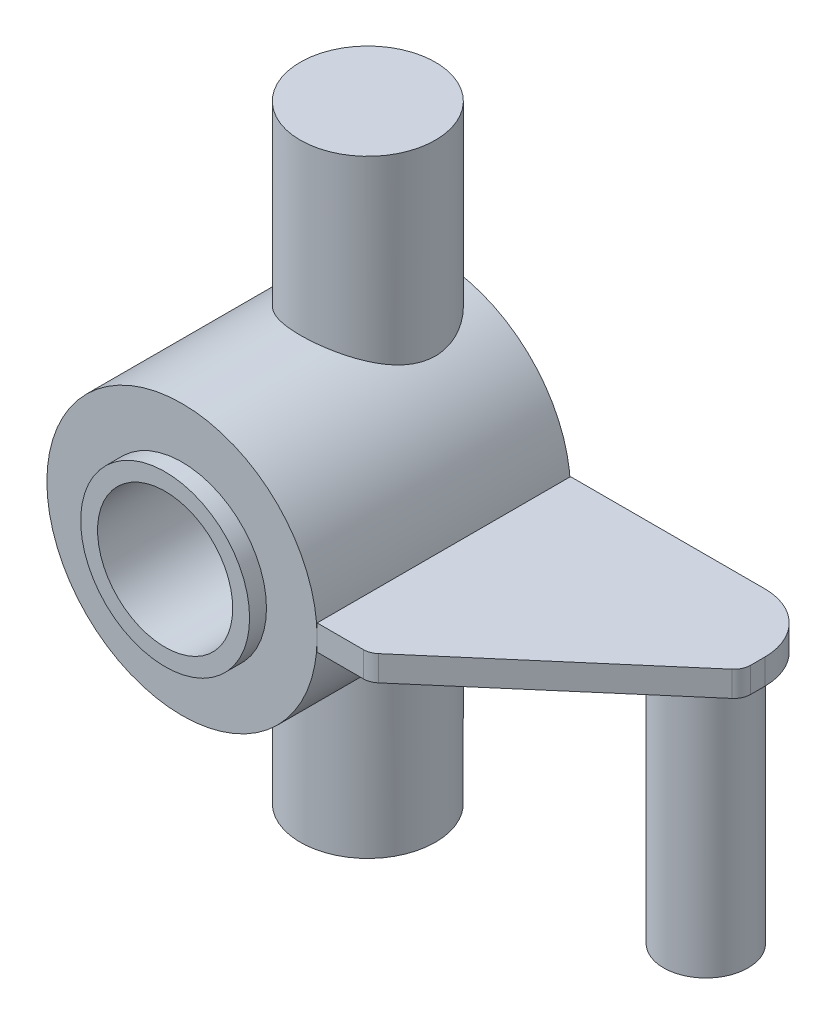
ISO-10303-21;
HEADER;
FILE_DESCRIPTION(('STEP AP214'),'2;1');
FILE_NAME('part.step','',(''),(''),'','','');
FILE_SCHEMA(('AUTOMOTIVE_DESIGN { 1 0 10303 214 1 1 1 1 }'));
ENDSEC;
DATA;
#1=APPLICATION_CONTEXT('core data for automotive mechanical design processes');
#2=APPLICATION_PROTOCOL_DEFINITION('international standard','automotive_design',2000,#1);
#3=PRODUCT_CONTEXT('',#1,'mechanical');
#4=PRODUCT('Part','Part','',(#3));
#5=PRODUCT_RELATED_PRODUCT_CATEGORY('part','',(#4));
#6=PRODUCT_DEFINITION_FORMATION('','',#4);
#7=PRODUCT_DEFINITION_CONTEXT('part definition',#1,'design');
#8=PRODUCT_DEFINITION('design','',#6,#7);
#9=PRODUCT_DEFINITION_SHAPE('','',#8);
#10=(LENGTH_UNIT() NAMED_UNIT(*) SI_UNIT(.MILLI.,.METRE.));
#11=(NAMED_UNIT(*) PLANE_ANGLE_UNIT() SI_UNIT($,.RADIAN.));
#12=(NAMED_UNIT(*) SI_UNIT($,.STERADIAN.) SOLID_ANGLE_UNIT());
#13=UNCERTAINTY_MEASURE_WITH_UNIT(LENGTH_MEASURE(1.E-05),#10,'distance_accuracy_value','');
#14=(GEOMETRIC_REPRESENTATION_CONTEXT(3) GLOBAL_UNCERTAINTY_ASSIGNED_CONTEXT((#13)) GLOBAL_UNIT_ASSIGNED_CONTEXT((#10,
#11,#12)) REPRESENTATION_CONTEXT('',''));
#15=CARTESIAN_POINT('',(0.,0.,0.));
#16=DIRECTION('',(0.,0.,1.));
#17=DIRECTION('',(1.,0.,0.));
#18=AXIS2_PLACEMENT_3D('',#15,#16,#17);
#19=CARTESIAN_POINT('',(23.,0.750000000000004,0.));
#20=DIRECTION('',(0.,-1.,0.));
#21=DIRECTION('',(0.,0.,-1.));
#22=AXIS2_PLACEMENT_3D('',#19,#20,#21);
#23=PLANE('',#22);
#24=DIRECTION('',(0.758813097039513,0.,-0.651308439805062));
#25=VECTOR('',#24,1.);
#26=CARTESIAN_POINT('',(25.3687248158512,0.750000000000003,2.75970539256084));
#27=LINE('',#26,#25);
#28=CARTESIAN_POINT('',(11.3890501755666,0.749999999999998,14.7588130970395));
#29=VERTEX_POINT('',#28);
#30=CARTESIAN_POINT('',(22.6513084398051,0.750000000000002,5.09213247781869));
#31=VERTEX_POINT('',#30);
#32=EDGE_CURVE('E123',#29,#31,#27,.T.);
#33=ORIENTED_EDGE('',*,*,#32,.T.);
#34=CARTESIAN_POINT('',(22.,0.750000000000002,4.33331938077917));
#35=DIRECTION('',(0.,-1.,0.));
#36=DIRECTION('',(0.,0.,-1.));
#37=AXIS2_PLACEMENT_3D('',#34,#35,#36);
#38=CIRCLE('',#37,1.);
#39=CARTESIAN_POINT('',(23.,0.750000000000002,4.33331938077917));
#40=VERTEX_POINT('',#39);
#41=EDGE_CURVE('E71',#31,#40,#38,.F.);
#42=ORIENTED_EDGE('',*,*,#41,.T.);
#43=DIRECTION('',(0.,0.,1.));
#44=VECTOR('',#43,1.);
#45=CARTESIAN_POINT('',(23.,0.750000000000004,0.));
#46=LINE('',#45,#44);
#47=CARTESIAN_POINT('',(23.,0.750000000000002,3.5));
#48=VERTEX_POINT('',#47);
#49=EDGE_CURVE('E143',#48,#40,#46,.T.);
#50=ORIENTED_EDGE('',*,*,#49,.F.);
#51=CARTESIAN_POINT('',(19.5,0.750000000000002,3.5));
#52=DIRECTION('',(0.,-1.,0.));
#53=DIRECTION('',(0.,0.,-1.));
#54=AXIS2_PLACEMENT_3D('',#51,#52,#53);
#55=CIRCLE('',#54,3.5);
#56=CARTESIAN_POINT('',(19.5,0.750000000000004,0.));
#57=VERTEX_POINT('',#56);
#58=EDGE_CURVE('E132',#57,#48,#55,.T.);
#59=ORIENTED_EDGE('',*,*,#58,.F.);
#60=DIRECTION('',(-1.,0.,0.));
#61=VECTOR('',#60,1.);
#62=CARTESIAN_POINT('',(23.,0.750000000000004,0.));
#63=LINE('',#62,#61);
#64=CARTESIAN_POINT('',(8.,0.750000000000004,0.));
#65=VERTEX_POINT('',#64);
#66=EDGE_CURVE('E131',#57,#65,#63,.T.);
#67=ORIENTED_EDGE('',*,*,#66,.T.);
#68=DIRECTION('',(0.,0.,1.));
#69=VECTOR('',#68,1.);
#70=CARTESIAN_POINT('',(8.,0.750000000000004,0.));
#71=LINE('',#70,#69);
#72=CARTESIAN_POINT('',(8.,0.749999999999998,15.));
#73=VERTEX_POINT('',#72);
#74=EDGE_CURVE('E223',#65,#73,#71,.T.);
#75=ORIENTED_EDGE('',*,*,#74,.T.);
#76=DIRECTION('',(-1.,0.,0.));
#77=VECTOR('',#76,1.);
#78=CARTESIAN_POINT('',(23.,0.749999999999998,15.));
#79=LINE('',#78,#77);
#80=CARTESIAN_POINT('',(10.7377417357616,0.749999999999998,15.));
#81=VERTEX_POINT('',#80);
#82=EDGE_CURVE('E141',#81,#73,#79,.T.);
#83=ORIENTED_EDGE('',*,*,#82,.F.);
#84=CARTESIAN_POINT('',(10.7377417357616,0.749999999999999,14.));
#85=DIRECTION('',(0.,-1.,0.));
#86=DIRECTION('',(0.,0.,-1.));
#87=AXIS2_PLACEMENT_3D('',#84,#85,#86);
#88=CIRCLE('',#87,1.);
#89=EDGE_CURVE('E158',#81,#29,#88,.F.);
#90=ORIENTED_EDGE('',*,*,#89,.T.);
#91=EDGE_LOOP('',(#33,#42,#50,#59,#67,#75,#83,#90));
#92=FACE_BOUND('',#91,.T.);
#93=ADVANCED_FACE('F48',(#92),#23,.F.);
#94=CARTESIAN_POINT('',(23.,-0.750000000000004,0.));
#95=DIRECTION('',(0.,1.,0.));
#96=DIRECTION('',(0.,0.,1.));
#97=AXIS2_PLACEMENT_3D('',#94,#95,#96);
#98=PLANE('',#97);
#99=CARTESIAN_POINT('',(19.4463189334762,-0.750000000000004,3.43499495567666));
#100=DIRECTION('',(0.,1.,0.));
#101=DIRECTION('',(0.,0.,1.));
#102=AXIS2_PLACEMENT_3D('',#99,#100,#101);
#103=CIRCLE('',#102,2.5);
#104=CARTESIAN_POINT('',(19.4463189334762,-0.750000000000004,5.93499495567665));
#105=VERTEX_POINT('',#104);
#106=EDGE_CURVE('E12',#105,#105,#103,.F.);
#107=ORIENTED_EDGE('',*,*,#106,.F.);
#108=EDGE_LOOP('',(#107));
#109=FACE_BOUND('',#108,.T.);
#110=DIRECTION('',(0.,0.,-1.));
#111=VECTOR('',#110,1.);
#112=CARTESIAN_POINT('',(23.,-0.750000000000004,0.));
#113=LINE('',#112,#111);
#114=CARTESIAN_POINT('',(23.,-0.750000000000003,4.33331938077917));
#115=VERTEX_POINT('',#114);
#116=CARTESIAN_POINT('',(23.,-0.750000000000003,3.5));
#117=VERTEX_POINT('',#116);
#118=EDGE_CURVE('E139',#115,#117,#113,.T.);
#119=ORIENTED_EDGE('',*,*,#118,.F.);
#120=CARTESIAN_POINT('',(22.,-0.750000000000004,4.33331938077917));
#121=DIRECTION('',(0.,1.,0.));
#122=DIRECTION('',(0.,0.,1.));
#123=AXIS2_PLACEMENT_3D('',#120,#121,#122);
#124=CIRCLE('',#123,1.);
#125=CARTESIAN_POINT('',(22.6513084398051,-0.750000000000003,5.09213247781868));
#126=VERTEX_POINT('',#125);
#127=EDGE_CURVE('E56',#115,#126,#124,.F.);
#128=ORIENTED_EDGE('',*,*,#127,.T.);
#129=DIRECTION('',(0.758813097039512,0.,-0.651308439805062));
#130=VECTOR('',#129,1.);
#131=CARTESIAN_POINT('',(12.1253865423612,-0.750000000000002,14.1267970022992));
#132=LINE('',#131,#130);
#133=CARTESIAN_POINT('',(11.3890501755666,-0.750000000000002,14.7588130970395));
#134=VERTEX_POINT('',#133);
#135=EDGE_CURVE('E167',#134,#126,#132,.T.);
#136=ORIENTED_EDGE('',*,*,#135,.F.);
#137=CARTESIAN_POINT('',(10.7377417357616,-0.750000000000002,14.));
#138=DIRECTION('',(0.,1.,0.));
#139=DIRECTION('',(0.,0.,1.));
#140=AXIS2_PLACEMENT_3D('',#137,#138,#139);
#141=CIRCLE('',#140,1.);
#142=CARTESIAN_POINT('',(10.7377417357616,-0.750000000000002,15.));
#143=VERTEX_POINT('',#142);
#144=EDGE_CURVE('E154',#134,#143,#141,.F.);
#145=ORIENTED_EDGE('',*,*,#144,.T.);
#146=DIRECTION('',(-1.,0.,0.));
#147=VECTOR('',#146,1.);
#148=CARTESIAN_POINT('',(23.,-0.750000000000002,15.));
#149=LINE('',#148,#147);
#150=CARTESIAN_POINT('',(8.,-0.750000000000002,15.));
#151=VERTEX_POINT('',#150);
#152=EDGE_CURVE('E138',#143,#151,#149,.T.);
#153=ORIENTED_EDGE('',*,*,#152,.T.);
#154=DIRECTION('',(0.,0.,-1.));
#155=VECTOR('',#154,1.);
#156=CARTESIAN_POINT('',(8.,-0.750000000000004,0.));
#157=LINE('',#156,#155);
#158=CARTESIAN_POINT('',(8.,-0.750000000000004,0.));
#159=VERTEX_POINT('',#158);
#160=EDGE_CURVE('E136',#151,#159,#157,.T.);
#161=ORIENTED_EDGE('',*,*,#160,.T.);
#162=DIRECTION('',(-1.,0.,0.));
#163=VECTOR('',#162,1.);
#164=CARTESIAN_POINT('',(23.,-0.750000000000004,0.));
#165=LINE('',#164,#163);
#166=CARTESIAN_POINT('',(19.5,-0.750000000000004,0.));
#167=VERTEX_POINT('',#166);
#168=EDGE_CURVE('E129',#167,#159,#165,.T.);
#169=ORIENTED_EDGE('',*,*,#168,.F.);
#170=CARTESIAN_POINT('',(19.5,-0.750000000000003,3.5));
#171=DIRECTION('',(0.,-1.,0.));
#172=DIRECTION('',(0.,0.,-1.));
#173=AXIS2_PLACEMENT_3D('',#170,#171,#172);
#174=CIRCLE('',#173,3.5);
#175=EDGE_CURVE('E114',#167,#117,#174,.T.);
#176=ORIENTED_EDGE('',*,*,#175,.T.);
#177=EDGE_LOOP('',(#119,#128,#136,#145,#153,#161,#169,#176));
#178=FACE_BOUND('',#177,.T.);
#179=ADVANCED_FACE('F134',(#109,#178),#98,.F.);
#180=CARTESIAN_POINT('',(23.,-0.750000000000004,0.));
#181=DIRECTION('',(0.,0.,1.));
#182=DIRECTION('',(0.,-1.,0.));
#183=AXIS2_PLACEMENT_3D('',#180,#181,#182);
#184=PLANE('',#183);
#185=ORIENTED_EDGE('',*,*,#66,.F.);
#186=DIRECTION('',(0.,-1.,0.));
#187=VECTOR('',#186,1.);
#188=CARTESIAN_POINT('',(19.5,14.25,0.));
#189=LINE('',#188,#187);
#190=EDGE_CURVE('E117',#57,#167,#189,.T.);
#191=ORIENTED_EDGE('',*,*,#190,.T.);
#192=ORIENTED_EDGE('',*,*,#168,.T.);
#193=DIRECTION('',(0.,1.,0.));
#194=VECTOR('',#193,1.);
#195=CARTESIAN_POINT('',(8.,-0.750000000000004,0.));
#196=LINE('',#195,#194);
#197=EDGE_CURVE('E220',#159,#65,#196,.T.);
#198=ORIENTED_EDGE('',*,*,#197,.T.);
#199=EDGE_LOOP('',(#185,#191,#192,#198));
#200=FACE_BOUND('',#199,.T.);
#201=ADVANCED_FACE('F127',(#200),#184,.F.);
#202=CARTESIAN_POINT('',(23.,-0.750000000000002,15.));
#203=DIRECTION('',(0.,0.,-1.));
#204=DIRECTION('',(-1.,0.,0.));
#205=AXIS2_PLACEMENT_3D('',#202,#203,#204);
#206=PLANE('',#205);
#207=ORIENTED_EDGE('',*,*,#152,.F.);
#208=DIRECTION('',(0.,-1.,0.));
#209=VECTOR('',#208,1.);
#210=CARTESIAN_POINT('',(10.7377417357616,-0.750000000000004,15.));
#211=LINE('',#210,#209);
#212=EDGE_CURVE('E156',#143,#81,#211,.F.);
#213=ORIENTED_EDGE('',*,*,#212,.T.);
#214=ORIENTED_EDGE('',*,*,#82,.T.);
#215=DIRECTION('',(0.,-1.,0.));
#216=VECTOR('',#215,1.);
#217=CARTESIAN_POINT('',(8.,-0.750000000000002,15.));
#218=LINE('',#217,#216);
#219=EDGE_CURVE('E213',#73,#151,#218,.T.);
#220=ORIENTED_EDGE('',*,*,#219,.T.);
#221=EDGE_LOOP('',(#207,#213,#214,#220));
#222=FACE_BOUND('',#221,.T.);
#223=ADVANCED_FACE('F196',(#222),#206,.F.);
#224=CARTESIAN_POINT('',(23.,0.,0.));
#225=DIRECTION('',(1.,0.,0.));
#226=DIRECTION('',(0.,0.,-1.));
#227=AXIS2_PLACEMENT_3D('',#224,#225,#226);
#228=PLANE('',#227);
#229=ORIENTED_EDGE('',*,*,#49,.T.);
#230=DIRECTION('',(0.,1.,0.));
#231=VECTOR('',#230,1.);
#232=CARTESIAN_POINT('',(23.,-0.750000000000002,4.33331938077917));
#233=LINE('',#232,#231);
#234=EDGE_CURVE('E63',#40,#115,#233,.F.);
#235=ORIENTED_EDGE('',*,*,#234,.T.);
#236=ORIENTED_EDGE('',*,*,#118,.T.);
#237=DIRECTION('',(0.,-1.,0.));
#238=VECTOR('',#237,1.);
#239=CARTESIAN_POINT('',(23.,14.25,3.5));
#240=LINE('',#239,#238);
#241=EDGE_CURVE('E120',#48,#117,#240,.T.);
#242=ORIENTED_EDGE('',*,*,#241,.F.);
#243=EDGE_LOOP('',(#229,#235,#236,#242));
#244=FACE_BOUND('',#243,.T.);
#245=ADVANCED_FACE('F201',(#244),#228,.T.);
#246=CARTESIAN_POINT('',(8.,0.,0.));
#247=DIRECTION('',(1.,0.,0.));
#248=DIRECTION('',(0.,0.,-1.));
#249=AXIS2_PLACEMENT_3D('',#246,#247,#248);
#250=PLANE('',#249);
#251=ORIENTED_EDGE('',*,*,#197,.F.);
#252=ORIENTED_EDGE('',*,*,#160,.F.);
#253=ORIENTED_EDGE('',*,*,#219,.F.);
#254=ORIENTED_EDGE('',*,*,#74,.F.);
#255=EDGE_LOOP('',(#251,#252,#253,#254));
#256=FACE_BOUND('',#255,.T.);
#257=ADVANCED_FACE('F206',(#256),#250,.F.);
#258=CARTESIAN_POINT('',(19.5,14.25,3.5));
#259=DIRECTION('',(0.,-1.,0.));
#260=DIRECTION('',(0.,0.,-1.));
#261=AXIS2_PLACEMENT_3D('',#258,#259,#260);
#262=CYLINDRICAL_SURFACE('',#261,3.5);
#263=ORIENTED_EDGE('',*,*,#58,.T.);
#264=ORIENTED_EDGE('',*,*,#241,.T.);
#265=ORIENTED_EDGE('',*,*,#175,.F.);
#266=ORIENTED_EDGE('',*,*,#190,.F.);
#267=EDGE_LOOP('',(#263,#264,#265,#266));
#268=FACE_BOUND('',#267,.T.);
#269=ADVANCED_FACE('F116',(#268),#262,.T.);
#270=CARTESIAN_POINT('',(12.1253865423612,14.25,14.1267970022992));
#271=DIRECTION('',(-0.651308439805061,0.,-0.758813097039512));
#272=DIRECTION('',(-0.758813097039513,0.,0.651308439805062));
#273=AXIS2_PLACEMENT_3D('',#270,#271,#272);
#274=PLANE('',#273);
#275=ORIENTED_EDGE('',*,*,#135,.T.);
#276=DIRECTION('',(0.,1.,0.));
#277=VECTOR('',#276,1.);
#278=CARTESIAN_POINT('',(22.6513084398051,0.750000000000003,5.09213247781868));
#279=LINE('',#278,#277);
#280=EDGE_CURVE('E160',#126,#31,#279,.T.);
#281=ORIENTED_EDGE('',*,*,#280,.T.);
#282=ORIENTED_EDGE('',*,*,#32,.F.);
#283=DIRECTION('',(0.,-1.,0.));
#284=VECTOR('',#283,1.);
#285=CARTESIAN_POINT('',(11.3890501755666,14.25,14.7588130970395));
#286=LINE('',#285,#284);
#287=EDGE_CURVE('E151',#29,#134,#286,.T.);
#288=ORIENTED_EDGE('',*,*,#287,.T.);
#289=EDGE_LOOP('',(#275,#281,#282,#288));
#290=FACE_BOUND('',#289,.T.);
#291=ADVANCED_FACE('F171',(#290),#274,.F.);
#292=CARTESIAN_POINT('',(10.7377417357616,14.25,14.));
#293=DIRECTION('',(0.,-1.,0.));
#294=DIRECTION('',(1.,0.,0.));
#295=AXIS2_PLACEMENT_3D('',#292,#293,#294);
#296=CYLINDRICAL_SURFACE('',#295,1.);
#297=ORIENTED_EDGE('',*,*,#89,.F.);
#298=ORIENTED_EDGE('',*,*,#212,.F.);
#299=ORIENTED_EDGE('',*,*,#144,.F.);
#300=ORIENTED_EDGE('',*,*,#287,.F.);
#301=EDGE_LOOP('',(#297,#298,#299,#300));
#302=FACE_BOUND('',#301,.T.);
#303=ADVANCED_FACE('F178',(#302),#296,.T.);
#304=CARTESIAN_POINT('',(22.,14.25,4.33331938077917));
#305=DIRECTION('',(0.,-1.,0.));
#306=DIRECTION('',(0.,0.,-1.));
#307=AXIS2_PLACEMENT_3D('',#304,#305,#306);
#308=CYLINDRICAL_SURFACE('',#307,1.);
#309=ORIENTED_EDGE('',*,*,#127,.F.);
#310=ORIENTED_EDGE('',*,*,#234,.F.);
#311=ORIENTED_EDGE('',*,*,#41,.F.);
#312=ORIENTED_EDGE('',*,*,#280,.F.);
#313=EDGE_LOOP('',(#309,#310,#311,#312));
#314=FACE_BOUND('',#313,.T.);
#315=ADVANCED_FACE('F50',(#314),#308,.T.);
#316=CARTESIAN_POINT('',(19.4463189334762,-15.75,3.43499495567666));
#317=DIRECTION('',(0.,1.,0.));
#318=DIRECTION('',(0.,0.,1.));
#319=AXIS2_PLACEMENT_3D('',#316,#317,#318);
#320=CYLINDRICAL_SURFACE('',#319,2.5);
#321=CARTESIAN_POINT('',(19.4463189334762,-15.75,3.43499495567666));
#322=DIRECTION('',(0.,-1.,0.));
#323=DIRECTION('',(0.,0.,-1.));
#324=AXIS2_PLACEMENT_3D('',#321,#322,#323);
#325=CIRCLE('',#324,2.5);
#326=CARTESIAN_POINT('',(19.4463189334762,-15.75,0.93499495567666));
#327=VERTEX_POINT('',#326);
#328=EDGE_CURVE('E174',#327,#327,#325,.T.);
#329=ORIENTED_EDGE('',*,*,#328,.F.);
#330=EDGE_LOOP('',(#329));
#331=FACE_BOUND('',#330,.T.);
#332=ORIENTED_EDGE('',*,*,#106,.T.);
#333=EDGE_LOOP('',(#332));
#334=FACE_BOUND('',#333,.T.);
#335=ADVANCED_FACE('F177',(#331,#334),#320,.T.);
#336=CARTESIAN_POINT('',(0.,-15.75,0.));
#337=DIRECTION('',(0.,-1.,0.));
#338=DIRECTION('',(0.,0.,-1.));
#339=AXIS2_PLACEMENT_3D('',#336,#337,#338);
#340=PLANE('',#339);
#341=ORIENTED_EDGE('',*,*,#328,.T.);
#342=EDGE_LOOP('',(#341));
#343=FACE_BOUND('',#342,.T.);
#344=ADVANCED_FACE('F183',(#343),#340,.T.);
#345=CLOSED_SHELL('',(#93,#179,#201,#223,#245,#257,#269,#291,#303,#315,#335,#344));
#346=MANIFOLD_SOLID_BREP('B2',#345);
#347=CARTESIAN_POINT('',(0.,18.,4.));
#348=DIRECTION('',(0.,-1.,0.));
#349=DIRECTION('',(0.,0.,-1.));
#350=AXIS2_PLACEMENT_3D('',#347,#348,#349);
#351=CYLINDRICAL_SURFACE('',#350,4.);
#352=CARTESIAN_POINT('',(0.,18.,4.));
#353=DIRECTION('',(0.,1.,0.));
#354=DIRECTION('',(0.,0.,1.));
#355=AXIS2_PLACEMENT_3D('',#352,#353,#354);
#356=CIRCLE('',#355,4.);
#357=CARTESIAN_POINT('',(0.,18.,8.));
#358=VERTEX_POINT('',#357);
#359=EDGE_CURVE('E47',#358,#358,#356,.T.);
#360=ORIENTED_EDGE('',*,*,#359,.F.);
#361=EDGE_LOOP('',(#360));
#362=FACE_BOUND('',#361,.T.);
#363=CARTESIAN_POINT('',(0.,8.,8.));
#364=CARTESIAN_POINT('',(0.105191216468488,7.99999964432188,7.99999959515221));
#365=CARTESIAN_POINT('',(0.210389995368427,7.99792027620652,7.99584554268467));
#366=CARTESIAN_POINT('',(0.420011249701336,7.98965597150982,7.97927792190077));
#367=CARTESIAN_POINT('',(0.524433367425618,7.98346924887743,7.96686076043045));
#368=CARTESIAN_POINT('',(0.731828138370605,7.96713597659603,7.93388648530473));
#369=CARTESIAN_POINT('',(0.834798506711917,7.95698378017499,7.9133177633431));
#370=CARTESIAN_POINT('',(1.0384152051955,7.93298382243633,7.86428279244356));
#371=CARTESIAN_POINT('',(1.1390605669938,7.91913455043164,7.83581331493588));
#372=CARTESIAN_POINT('',(1.43561775388138,7.87265974292142,7.73925176888222));
#373=CARTESIAN_POINT('',(1.6271962065847,7.83501976471674,7.65983701915264));
#374=CARTESIAN_POINT('',(1.99392146995421,7.74982886318845,7.47371095891235));
#375=CARTESIAN_POINT('',(2.16906957469774,7.70227872135526,7.36700180061893));
#376=CARTESIAN_POINT('',(2.51002321260362,7.59825056785886,7.12193017740055));
#377=CARTESIAN_POINT('',(2.67462250306452,7.54140647262265,6.98204331180567));
#378=CARTESIAN_POINT('',(2.97911611963431,7.42640030348014,6.67792486241435));
#379=CARTESIAN_POINT('',(3.11899161990724,7.3682372629647,6.51367490095672));
#380=CARTESIAN_POINT('',(3.38102385527715,7.25195135134797,6.15002101287013));
#381=CARTESIAN_POINT('',(3.50096528772936,7.19418138823907,5.94887869572524));
#382=CARTESIAN_POINT('',(3.65378721735264,7.11709930290977,5.63206546004573));
#383=CARTESIAN_POINT('',(3.70022392693971,7.09299422837207,5.5239053371934));
#384=CARTESIAN_POINT('',(3.78359067078057,7.04887690211806,5.30319902892111));
#385=CARTESIAN_POINT('',(3.82052633371565,7.02886222858683,5.19065548607789));
#386=CARTESIAN_POINT('',(3.88251046204454,6.9948044998643,4.96880578069376));
#387=CARTESIAN_POINT('',(3.9081340887804,6.9804776446802,4.85970358083543));
#388=CARTESIAN_POINT('',(3.95018060072941,6.95677065788593,4.63925947717983));
#389=CARTESIAN_POINT('',(3.96660836750271,6.9473879018896,4.52791879424739));
#390=CARTESIAN_POINT('',(3.99001913809428,6.93396933490057,4.30399390653389));
#391=CARTESIAN_POINT('',(3.99700782997252,6.92993030376772,4.19141049191159));
#392=CARTESIAN_POINT('',(4.00144340059851,6.92737022415464,3.96599952196127));
#393=CARTESIAN_POINT('',(3.99889118971828,6.92884864921082,3.853171990953));
#394=CARTESIAN_POINT('',(3.98516575152016,6.93675038555112,3.64183562155368));
#395=CARTESIAN_POINT('',(3.97506329407581,6.94255931040713,3.54323256042783));
#396=CARTESIAN_POINT('',(3.94763759493625,6.95818925294571,3.34734838783369));
#397=CARTESIAN_POINT('',(3.93031208534669,6.96801153072177,3.2500677014795));
#398=CARTESIAN_POINT('',(3.86777248849784,7.00304835203764,2.96122086709978));
#399=CARTESIAN_POINT('',(3.81198555026409,7.03383903740602,2.77250454291879));
#400=CARTESIAN_POINT('',(3.67283599572519,7.10749917506982,2.4030536672292));
#401=CARTESIAN_POINT('',(3.58886132884632,7.15063327143764,2.22260742465183));
#402=CARTESIAN_POINT('',(3.39616568981264,7.2441365265382,1.87746981298511));
#403=CARTESIAN_POINT('',(3.28743360222607,7.29450893132236,1.71278556793507));
#404=CARTESIAN_POINT('',(3.03227252755196,7.40452458073482,1.38191711829539));
#405=CARTESIAN_POINT('',(2.88281182497071,7.46453347888883,1.21819042929159));
#406=CARTESIAN_POINT('',(2.55818830727484,7.58191186589975,0.917040393499512));
#407=CARTESIAN_POINT('',(2.38301327894514,7.63928008344308,0.779629617525468));
#408=CARTESIAN_POINT('',(2.09944472683198,7.7202760768617,0.593246969785754));
#409=CARTESIAN_POINT('',(1.9989679987013,7.74696304862188,0.533318240246936));
#410=CARTESIAN_POINT('',(1.79256850112001,7.79730441532266,0.42223352122335));
#411=CARTESIAN_POINT('',(1.68664805204876,7.82096008757468,0.37107383360208));
#412=CARTESIAN_POINT('',(1.47010242051538,7.86454042959534,0.278080877627199));
#413=CARTESIAN_POINT('',(1.35947915341347,7.88446660078232,0.236243854867457));
#414=CARTESIAN_POINT('',(1.13432950721217,7.91999221203723,0.162380061448199));
#415=CARTESIAN_POINT('',(1.01980357880328,7.9355921498224,0.130352162240849));
#416=CARTESIAN_POINT('',(0.797438403015335,7.96087677585623,0.0787731521448827));
#417=CARTESIAN_POINT('',(0.68983090685457,7.9709443603734,0.058408402943018));
#418=CARTESIAN_POINT('',(0.472998720376382,7.98674429615844,0.0265535517575012));
#419=CARTESIAN_POINT('',(0.363774173887724,7.99247703065614,0.0150626652629393));
#420=CARTESIAN_POINT('',(0.144648447401173,7.99944300548302,0.00110952845549016));
#421=CARTESIAN_POINT('',(0.0347475425961453,8.00067796839692,-0.00135617837901456));
#422=CARTESIAN_POINT('',(-0.184837638972486,7.99861804620746,0.00276424211008771));
#423=CARTESIAN_POINT('',(-0.294521925108021,7.99532336157662,0.00934996883659231));
#424=CARTESIAN_POINT('',(-0.504259611746538,7.98472734940324,0.0306235695271645));
#425=CARTESIAN_POINT('',(-0.604398259266984,7.97775776257091,0.0446410691044307));
#426=CARTESIAN_POINT('',(-0.803035609307668,7.96021983565123,0.0801363996639103));
#427=CARTESIAN_POINT('',(-0.901533743070587,7.94965027363514,0.101616763793442));
#428=CARTESIAN_POINT('',(-1.19351737727532,7.91289127905722,0.176935173599938));
#429=CARTESIAN_POINT('',(-1.38368108667204,7.88164133135127,0.241670140590663));
#430=CARTESIAN_POINT('',(-1.75558493783058,7.80736894774679,0.399998108905637));
#431=CARTESIAN_POINT('',(-1.93692876519228,7.76403545540105,0.494363309171963));
#432=CARTESIAN_POINT('',(-2.28183826656572,7.66975878800211,0.708431034259749));
#433=CARTESIAN_POINT('',(-2.44539632212196,7.61881237399843,0.828144352631561));
#434=CARTESIAN_POINT('',(-2.76706877708067,7.50833088367007,1.10303311970347));
#435=CARTESIAN_POINT('',(-2.92307134240145,7.44844369061623,1.26053653725913));
#436=CARTESIAN_POINT('',(-3.20744226426287,7.33048735856255,1.5997355652547));
#437=CARTESIAN_POINT('',(-3.33579150415337,7.27241950081065,1.7814477716031));
#438=CARTESIAN_POINT('',(-3.50772930633183,7.19028164087441,2.0739940144221));
#439=CARTESIAN_POINT('',(-3.5626157867948,7.16316684054651,2.17748375843627));
#440=CARTESIAN_POINT('',(-3.66334616154282,7.11217812644117,2.38951843531651));
#441=CARTESIAN_POINT('',(-3.70919441458265,7.08830265221425,2.49806090009515));
#442=CARTESIAN_POINT('',(-3.79131200961919,7.04472262103751,2.71942164536428));
#443=CARTESIAN_POINT('',(-3.82758904080802,7.02501471854545,2.83223640979536));
#444=CARTESIAN_POINT('',(-3.89012004539429,6.9905825381999,3.06135278907153));
#445=CARTESIAN_POINT('',(-3.91637557070638,6.97585748874971,3.17765386102154));
#446=CARTESIAN_POINT('',(-3.95643062416587,6.95321025619991,3.40141213316309));
#447=CARTESIAN_POINT('',(-3.97118378192521,6.94477079792059,3.50864683290839));
#448=CARTESIAN_POINT('',(-3.99195118317071,6.93285441469714,3.72422767020064));
#449=CARTESIAN_POINT('',(-3.99796634225491,6.92937696981658,3.8325736901013));
#450=CARTESIAN_POINT('',(-4.00116308319383,6.92753208063799,4.04940749673038));
#451=CARTESIAN_POINT('',(-3.99834777004019,6.9291628401807,4.15789522022328));
#452=CARTESIAN_POINT('',(-3.98394653809981,6.9374509348198,4.37406114711354));
#453=CARTESIAN_POINT('',(-3.97236097836303,6.94410806413885,4.48173938346867));
#454=CARTESIAN_POINT('',(-3.92770249100378,6.96952879582861,4.7818001370413));
#455=CARTESIAN_POINT('',(-3.88483285002042,6.99372760142387,4.97236586731381));
#456=CARTESIAN_POINT('',(-3.77270184038046,7.05483682415845,5.34326850255324));
#457=CARTESIAN_POINT('',(-3.70343198216887,7.09175132993569,5.52360209570391));
#458=CARTESIAN_POINT('',(-3.53526338936952,7.17714225279385,5.882488553514));
#459=CARTESIAN_POINT('',(-3.43468670285354,7.22622883383996,6.06010777576172));
#460=CARTESIAN_POINT('',(-3.20860173383709,7.3294133274236,6.39710197827703));
#461=CARTESIAN_POINT('',(-3.08308048046464,7.38351383930109,6.55646739854074));
#462=CARTESIAN_POINT('',(-2.79282250805389,7.49849148240842,6.8725629090385));
#463=CARTESIAN_POINT('',(-2.62517402605099,7.55939328373464,7.02661992962373));
#464=CARTESIAN_POINT('',(-2.26458287075638,7.67511613929542,7.3050684228129));
#465=CARTESIAN_POINT('',(-2.07162664990559,7.72993390744395,7.42944390524207));
#466=CARTESIAN_POINT('',(-1.76603106757846,7.80335210517359,7.59090424941519));
#467=CARTESIAN_POINT('',(-1.66100410373827,7.82643367929072,7.64069364140905));
#468=CARTESIAN_POINT('',(-1.44639623629744,7.8689179624278,7.73114894700146));
#469=CARTESIAN_POINT('',(-1.33681760142932,7.88832247803741,7.77181934269804));
#470=CARTESIAN_POINT('',(-1.11415600876093,7.92283587265691,7.84347634443401));
#471=CARTESIAN_POINT('',(-1.00108129646084,7.93795411409434,7.87448407138671));
#472=CARTESIAN_POINT('',(-0.772189766950842,7.96347694583626,7.92651008001648));
#473=CARTESIAN_POINT('',(-0.656374670304615,7.97388441530454,7.94753446377235));
#474=CARTESIAN_POINT('',(-0.450433316283305,7.98781110043795,7.97557962119869));
#475=CARTESIAN_POINT('',(-0.360660623567813,7.99237392421376,7.98472938917604));
#476=CARTESIAN_POINT('',(-0.180593821057088,7.99846856848791,7.99693983637807));
#477=CARTESIAN_POINT('',(-0.0902996969389666,8.00000030532612,8.00000034753503));
#478=CARTESIAN_POINT('',(0.,8.,8.));
#479=B_SPLINE_CURVE_WITH_KNOTS('',3,(#363,#364,#365,#366,#367,#368,#369,#370,#371,#372,#373,
#374,#375,#376,#377,#378,#379,#380,#381,#382,#383,#384,#385,#386,#387,#388,#389,#390,#391,#392,
#393,#394,#395,#396,#397,#398,#399,#400,#401,#402,#403,#404,#405,#406,#407,#408,#409,#410,#411,
#412,#413,#414,#415,#416,#417,#418,#419,#420,#421,#422,#423,#424,#425,#426,#427,#428,#429,#430,
#431,#432,#433,#434,#435,#436,#437,#438,#439,#440,#441,#442,#443,#444,#445,#446,#447,#448,#449,
#450,#451,#452,#453,#454,#455,#456,#457,#458,#459,#460,#461,#462,#463,#464,#465,#466,#467,#468,
#469,#470,#471,#472,#473,#474,#475,#476,#477,#478),.UNSPECIFIED.,.T.,.F.,(4,2,2,2,2,2,2,2,2,2,2,
2,2,2,2,2,2,2,2,2,2,2,2,2,2,2,2,2,2,2,2,2,2,2,2,2,2,2,2,2,2,2,2,2,2,2,2,2,2,2,2,2,2,2,2,2,2,4),
(0.,0.315484235719912,0.631105747230253,0.947178346952276,1.26338029745354,1.89263632058595,
2.52184274094302,3.18911473348911,3.85689264923289,4.57645675584686,4.93648208726456,
5.29629363598333,5.63476191634051,5.97305035229576,6.31113484191767,6.64918707308226,
6.94669148652859,7.24428938086225,7.83905304157541,8.44767049128776,9.05656173495714,
9.74265853790341,10.4290822684957,10.7886699173095,11.1481055433964,11.5073961555811,
11.8666454155399,12.1961419049363,12.5256092612256,12.8549504227676,13.184277008843,
13.4879760335491,13.791778244799,14.3988188497914,15.02321622567,15.6478800144877,
16.33388641032,17.0203655291613,17.380682030865,17.7408243397693,18.1006764355618,
18.4604727825931,18.7857371805984,19.1109674938045,19.4360834615763,19.7611861199664,
20.3488209353335,20.9366448769134,21.5639619965908,22.1916061711245,22.8955134356508,
23.5997990605888,23.9548906509477,24.3098073249809,24.6639426811876,25.0178613011449,
25.2886761616556,25.5594984967416),.UNSPECIFIED.);
#480=CARTESIAN_POINT('',(0.,8.,8.));
#481=VERTEX_POINT('',#480);
#482=EDGE_CURVE('E321',#481,#481,#479,.T.);
#483=ORIENTED_EDGE('',*,*,#482,.T.);
#484=EDGE_LOOP('',(#483));
#485=FACE_BOUND('',#484,.T.);
#486=ADVANCED_FACE('F315',(#362,#485),#351,.T.);
#487=CARTESIAN_POINT('',(0.,18.,4.));
#488=DIRECTION('',(0.,1.,0.));
#489=DIRECTION('',(0.,0.,1.));
#490=AXIS2_PLACEMENT_3D('',#487,#488,#489);
#491=PLANE('',#490);
#492=ORIENTED_EDGE('',*,*,#359,.T.);
#493=EDGE_LOOP('',(#492));
#494=FACE_BOUND('',#493,.T.);
#495=ADVANCED_FACE('F336',(#494),#491,.T.);
#496=CARTESIAN_POINT('',(0.,0.,15.));
#497=DIRECTION('',(0.,0.,-1.));
#498=DIRECTION('',(-1.,0.,0.));
#499=AXIS2_PLACEMENT_3D('',#496,#497,#498);
#500=CYLINDRICAL_SURFACE('',#499,8.);
#501=ORIENTED_EDGE('',*,*,#482,.F.);
#502=EDGE_LOOP('',(#501));
#503=FACE_BOUND('',#502,.T.);
#504=ADVANCED_FACE('F333',(#503),#500,.F.);
#505=CLOSED_SHELL('',(#486,#495,#504));
#506=MANIFOLD_SOLID_BREP('B6',#505);
#507=CARTESIAN_POINT('',(0.,0.,15.));
#508=DIRECTION('',(0.,0.,-1.));
#509=DIRECTION('',(-1.,0.,0.));
#510=AXIS2_PLACEMENT_3D('',#507,#508,#509);
#511=CYLINDRICAL_SURFACE('',#510,8.);
#512=CARTESIAN_POINT('',(0.,0.,15.));
#513=DIRECTION('',(0.,0.,1.));
#514=DIRECTION('',(1.,0.,0.));
#515=AXIS2_PLACEMENT_3D('',#512,#513,#514);
#516=CIRCLE('',#515,8.);
#517=CARTESIAN_POINT('',(8.,0.,15.));
#518=VERTEX_POINT('',#517);
#519=EDGE_CURVE('E313',#518,#518,#516,.T.);
#520=ORIENTED_EDGE('',*,*,#519,.F.);
#521=EDGE_LOOP('',(#520));
#522=FACE_BOUND('',#521,.T.);
#523=CARTESIAN_POINT('',(0.,0.,0.));
#524=DIRECTION('',(0.,0.,1.));
#525=DIRECTION('',(1.,0.,0.));
#526=AXIS2_PLACEMENT_3D('',#523,#524,#525);
#527=CIRCLE('',#526,8.);
#528=CARTESIAN_POINT('',(0.,-8.,0.));
#529=VERTEX_POINT('',#528);
#530=EDGE_CURVE('E368',#529,#529,#527,.T.);
#531=ORIENTED_EDGE('',*,*,#530,.T.);
#532=CARTESIAN_POINT('',(4.00000000000001,-6.9282032302755,4.));
#533=CARTESIAN_POINT('',(3.99999950219345,-6.92820386262826,4.1042653254373));
#534=CARTESIAN_POINT('',(3.9959176319954,-6.93056511456488,4.20853992667939));
#535=CARTESIAN_POINT('',(3.97964472112407,-6.93992172463862,4.41628417460038));
#536=CARTESIAN_POINT('',(3.96744990521399,-6.94691924018481,4.51975342383269));
#537=CARTESIAN_POINT('',(3.93508538297522,-6.96530330045203,4.72521084556988));
#538=CARTESIAN_POINT('',(3.91490316893164,-6.97669672816262,4.82719643382953));
#539=CARTESIAN_POINT('',(3.86682062971259,-7.00345973447504,5.02881400167829));
#540=CARTESIAN_POINT('',(3.83891695064122,-7.01883104071991,5.12844493804267));
#541=CARTESIAN_POINT('',(3.74442772916635,-7.06996541785761,5.42168896600919));
#542=CARTESIAN_POINT('',(3.66684915651286,-7.11087904783325,5.61098585661696));
#543=CARTESIAN_POINT('',(3.4850607538011,-7.20170927952067,5.97372956380103));
#544=CARTESIAN_POINT('',(3.38084948302617,-7.25162636823861,6.14717552221941));
#545=CARTESIAN_POINT('',(3.13867639492106,-7.3598722626408,6.48920849434794));
#546=CARTESIAN_POINT('',(2.99863981046009,-7.41855528289904,6.65621486644762));
#547=CARTESIAN_POINT('',(2.69298354883076,-7.53488657765781,6.96565524064934));
#548=CARTESIAN_POINT('',(2.52735118809494,-7.59253432325008,7.10807698576393));
#549=CARTESIAN_POINT('',(2.25626437810993,-7.6758759355965,7.30498206648215));
#550=CARTESIAN_POINT('',(2.15870290429516,-7.70394919240218,7.36953226161913));
#551=CARTESIAN_POINT('',(1.95777427065883,-7.75744193796062,7.49010444022811));
#552=CARTESIAN_POINT('',(1.85440960246324,-7.78286255243594,7.54613004600924));
#553=CARTESIAN_POINT('',(1.64251485422607,-7.83032159918279,7.64911278165759));
#554=CARTESIAN_POINT('',(1.53398485456802,-7.85236008406491,7.6960700525899));
#555=CARTESIAN_POINT('',(1.3125858096749,-7.89238619731919,7.78036194826573));
#556=CARTESIAN_POINT('',(1.19971924732416,-7.91037610439248,7.81770198768932));
#557=CARTESIAN_POINT('',(0.978622575683248,-7.94064573590697,7.88001829427466));
#558=CARTESIAN_POINT('',(0.870629018183695,-7.95323930006917,7.90568215305844));
#559=CARTESIAN_POINT('',(0.652524088435726,-7.97409583861317,7.94797970743347));
#560=CARTESIAN_POINT('',(0.542413779814414,-7.98236093189931,7.96461782151572));
#561=CARTESIAN_POINT('',(0.320973525125338,-7.99432715952591,7.98865586699747));
#562=CARTESIAN_POINT('',(0.209643937931229,-7.99802960221736,7.99605844671614));
#563=CARTESIAN_POINT('',(-0.0132971447801722,-8.0007656004484,8.00153168636999));
#564=CARTESIAN_POINT('',(-0.124908622632314,-7.99979944163708,7.99960291724515));
#565=CARTESIAN_POINT('',(-0.337727985342423,-7.99351360464185,7.98701479129273));
#566=CARTESIAN_POINT('',(-0.438993817716938,-7.98858118408677,7.97713197765086));
#567=CARTESIAN_POINT('',(-0.640243249291353,-7.97497880011988,7.94973672090394));
#568=CARTESIAN_POINT('',(-0.740226424897065,-7.96630763313356,7.93222182086393));
#569=CARTESIAN_POINT('',(-1.03714138295469,-7.93497195498556,7.86848947730556));
#570=CARTESIAN_POINT('',(-1.23123936013571,-7.9069787607081,7.81107210299894));
#571=CARTESIAN_POINT('',(-1.6092687156014,-7.83886272517952,7.6676660261144));
#572=CARTESIAN_POINT('',(-1.79302228049015,-7.79857742343273,7.58129301759658));
#573=CARTESIAN_POINT('',(-2.14389861654609,-7.70950607728793,7.38294806552919));
#574=CARTESIAN_POINT('',(-2.31101540282593,-7.66071699099023,7.27096695718556));
#575=CARTESIAN_POINT('',(-2.64069813790284,-7.55377539869557,7.01241508000272));
#576=CARTESIAN_POINT('',(-2.80134064782814,-7.49517374441381,6.86357523984661));
#577=CARTESIAN_POINT('',(-3.096413130151,-7.37817491997775,6.54165375681343));
#578=CARTESIAN_POINT('',(-3.23082293513642,-7.31977794078033,6.36855363717567));
#579=CARTESIAN_POINT('',(-3.47803613314163,-7.20576112808083,5.98935711133187));
#580=CARTESIAN_POINT('',(-3.58892539602577,-7.15055315383099,5.78186338145237));
#581=CARTESIAN_POINT('',(-3.72723782010754,-7.07886925416584,5.45658261556123));
#582=CARTESIAN_POINT('',(-3.76867730715225,-7.05682593849463,5.34579164080266));
#583=CARTESIAN_POINT('',(-3.84175062064906,-7.01731299636541,5.12025515321879));
#584=CARTESIAN_POINT('',(-3.87339049322799,-6.99984055082838,5.00551212747387));
#585=CARTESIAN_POINT('',(-3.92431909326376,-6.97140602598867,4.78217133548265));
#586=CARTESIAN_POINT('',(-3.94438433855718,-6.96003957007805,4.67380134853994));
#587=CARTESIAN_POINT('',(-3.97551851361913,-6.94230335544128,4.45541909952217));
#588=CARTESIAN_POINT('',(-3.98659212183613,-6.93593099829036,4.34540772186559));
#589=CARTESIAN_POINT('',(-3.99958291311108,-6.92844811909925,4.12470748996731));
#590=CARTESIAN_POINT('',(-4.00150350567567,-6.92733563775176,4.01401890337321));
#591=CARTESIAN_POINT('',(-3.99616718095744,-6.93041539174955,3.79294330689436));
#592=CARTESIAN_POINT('',(-3.98891088315149,-6.93460726902939,3.68255627715739));
#593=CARTESIAN_POINT('',(-3.96663154579714,-6.94737197203376,3.47513061602036));
#594=CARTESIAN_POINT('',(-3.95254845698989,-6.95541341326253,3.3779567889877));
#595=CARTESIAN_POINT('',(-3.91737385475212,-6.97528372672039,3.18526806656622));
#596=CARTESIAN_POINT('',(-3.89628002700134,-6.98711384958699,3.08975372996381));
#597=CARTESIAN_POINT('',(-3.82280238446313,-7.02775685901555,2.80663196389194));
#598=CARTESIAN_POINT('',(-3.76020731695077,-7.06173163693377,2.62230856572734));
#599=CARTESIAN_POINT('',(-3.60658595732554,-7.14144993292041,2.25832541229841));
#600=CARTESIAN_POINT('',(-3.51437713951607,-7.18766564346826,2.07927704666103));
#601=CARTESIAN_POINT('',(-3.30514737086267,-7.28624486618866,1.73812980331287));
#602=CARTESIAN_POINT('',(-3.18811367399407,-7.33861153030439,1.57603969669191));
#603=CARTESIAN_POINT('',(-2.91535761342628,-7.45151836616993,1.25208687714178));
#604=CARTESIAN_POINT('',(-2.75661800037809,-7.51225675092662,1.09282841283409));
#605=CARTESIAN_POINT('',(-2.41358105803055,-7.62937597657745,0.802334026584154));
#606=CARTESIAN_POINT('',(-2.22927513013699,-7.68575534144676,0.671107570383756));
#607=CARTESIAN_POINT('',(-1.93419225408146,-7.76335543938379,0.496792217762809));
#608=CARTESIAN_POINT('',(-1.83122945254024,-7.78834354202674,0.441869942701289));
#609=CARTESIAN_POINT('',(-1.62028527572798,-7.83494183925331,0.34099446912297));
#610=CARTESIAN_POINT('',(-1.51230618469743,-7.85655355213899,0.295037236861767));
#611=CARTESIAN_POINT('',(-1.29213403393068,-7.89575152015211,0.212625673359868));
#612=CARTESIAN_POINT('',(-1.17994299872754,-7.91333968113673,0.176166841820374));
#613=CARTESIAN_POINT('',(-0.952197786601979,-7.94396070933363,0.113192739054084));
#614=CARTESIAN_POINT('',(-0.836644010238124,-7.95699411670659,0.0866762887059286));
#615=CARTESIAN_POINT('',(-0.613942900584693,-7.97711749125789,0.0459279500527829));
#616=CARTESIAN_POINT('',(-0.506999857370266,-7.98464383966398,0.0307905272241886));
#617=CARTESIAN_POINT('',(-0.291983714868724,-7.99539449729097,0.00920788664752355));
#618=CARTESIAN_POINT('',(-0.183910251308576,-7.99861737381754,0.00276556362899211));
#619=CARTESIAN_POINT('',(0.03236920279163,-8.00066496370437,-0.00133014208550515));
#620=CARTESIAN_POINT('',(0.140575049615288,-7.99949272302419,0.00101038841557485));
#621=CARTESIAN_POINT('',(0.356345776551111,-7.99278884324615,0.0144376708259707));
#622=CARTESIAN_POINT('',(0.463910407218418,-7.9872556066098,0.0255276278637623));
#623=CARTESIAN_POINT('',(0.670402230454413,-7.97248705040341,0.0552939773904399));
#624=CARTESIAN_POINT('',(0.769428771379719,-7.96352188946078,0.0734178487040997));
#625=CARTESIAN_POINT('',(0.96549401655823,-7.94213883037982,0.116969937488292));
#626=CARTESIAN_POINT('',(1.06253202988244,-7.92971975328176,0.142400649174037));
#627=CARTESIAN_POINT('',(1.34967669515382,-7.88769036296796,0.229286595750671));
#628=CARTESIAN_POINT('',(1.535990515319,-7.85329454083082,0.301361540160017));
#629=CARTESIAN_POINT('',(1.90172389087137,-7.77303546188782,0.474913777280617));
#630=CARTESIAN_POINT('',(2.08050775123498,-7.72674465907378,0.577516772333945));
#631=CARTESIAN_POINT('',(2.41909138351715,-7.62752535456451,0.80783224417312));
#632=CARTESIAN_POINT('',(2.57888238184509,-7.57459380826236,0.935556253632443));
#633=CARTESIAN_POINT('',(2.8916543099683,-7.46114622775076,1.22718013687798));
#634=CARTESIAN_POINT('',(3.04237488708293,-7.40039963213063,1.39341522683605));
#635=CARTESIAN_POINT('',(3.31466901461284,-7.28251536809497,1.74983763817227));
#636=CARTESIAN_POINT('',(3.43621677845464,-7.22538092516391,1.94004592524942));
#637=CARTESIAN_POINT('',(3.59554085555899,-7.14673032771597,2.24337573615295));
#638=CARTESIAN_POINT('',(3.64540546855455,-7.12134958638073,2.34930106826833));
#639=CARTESIAN_POINT('',(3.7358834166029,-7.07430377646636,2.56580437696515));
#640=CARTESIAN_POINT('',(3.77650151690077,-7.05263679540785,2.67637992206191));
#641=CARTESIAN_POINT('',(3.84790167044831,-7.01393620687008,2.90112629943264));
#642=CARTESIAN_POINT('',(3.87870902746066,-6.99689069691894,3.01528703446802));
#643=CARTESIAN_POINT('',(3.93016568856618,-6.96811827819219,3.24647371557682));
#644=CARTESIAN_POINT('',(3.95082209480825,-6.95638765128934,3.36349759808763));
#645=CARTESIAN_POINT('',(3.97745846425998,-6.94118032889089,3.56719830954344));
#646=CARTESIAN_POINT('',(3.98590343866334,-6.93632575562013,3.6534593729815));
#647=CARTESIAN_POINT('',(3.99717460159989,-6.92983683549392,3.82647812798563));
#648=CARTESIAN_POINT('',(4.00000041424857,-6.92820270406463,3.91323585238573));
#649=CARTESIAN_POINT('',(4.00000000000001,-6.9282032302755,4.));
#650=B_SPLINE_CURVE_WITH_KNOTS('',3,(#532,#533,#534,#535,#536,#537,#538,#539,#540,#541,#542,
#543,#544,#545,#546,#547,#548,#549,#550,#551,#552,#553,#554,#555,#556,#557,#558,#559,#560,#561,
#562,#563,#564,#565,#566,#567,#568,#569,#570,#571,#572,#573,#574,#575,#576,#577,#578,#579,#580,
#581,#582,#583,#584,#585,#586,#587,#588,#589,#590,#591,#592,#593,#594,#595,#596,#597,#598,#599,
#600,#601,#602,#603,#604,#605,#606,#607,#608,#609,#610,#611,#612,#613,#614,#615,#616,#617,#618,
#619,#620,#621,#622,#623,#624,#625,#626,#627,#628,#629,#630,#631,#632,#633,#634,#635,#636,#637,
#638,#639,#640,#641,#642,#643,#644,#645,#646,#647,#648,#649),.UNSPECIFIED.,.T.,.F.,(4,2,2,2,2,2,
2,2,2,2,2,2,2,2,2,2,2,2,2,2,2,2,2,2,2,2,2,2,2,2,2,2,2,2,2,2,2,2,2,2,2,2,2,2,2,2,2,2,2,2,2,2,2,2,
2,2,2,2,4),(0.,0.312705907645188,0.625557430139016,0.93890080736969,1.25238050266336,
1.87532331508721,2.49829983322606,3.1726581814384,3.8473517748203,4.20786878872691,
4.56823217961299,4.92858996431118,5.28874441516655,5.62343001077676,5.95795161516748,
6.29237727234833,6.62678246790366,6.93200651230821,7.23732888766059,7.84737748897727,
8.46586637752493,9.08457696228994,9.76177264655468,10.4394869181158,11.160238657457,
11.5207615871968,11.8810616378014,12.212984058814,12.5447336660446,12.8763596865808,
13.2079633222266,13.5031682056198,13.7984706362685,14.38866539675,15.006195155551,
15.6240427481094,16.319773042532,17.0157378984356,17.3733524504477,17.7308057238246,
18.0880893282017,18.4453305469501,18.7697157004162,19.0942088199644,19.4184770967801,
19.7428642161659,20.0457160884446,20.3486714633268,20.9540518089476,21.585324497246,
22.2168876724958,22.9113041424698,23.6063321822733,23.9652997079033,24.3240818165632,
24.6819309195696,25.0395292944428,25.2997293817866,25.5599468741983),.UNSPECIFIED.);
#651=EDGE_CURVE('E396',#529,#529,#650,.T.);
#652=ORIENTED_EDGE('',*,*,#651,.F.);
#653=EDGE_LOOP('',(#531,#652));
#654=FACE_BOUND('',#653,.T.);
#655=ADVANCED_FACE('F365',(#522,#654),#511,.T.);
#656=CARTESIAN_POINT('',(0.,0.,15.));
#657=DIRECTION('',(0.,0.,1.));
#658=DIRECTION('',(1.,0.,0.));
#659=AXIS2_PLACEMENT_3D('',#656,#657,#658);
#660=PLANE('',#659);
#661=CARTESIAN_POINT('',(0.,0.,15.));
#662=DIRECTION('',(0.,0.,1.));
#663=DIRECTION('',(1.,0.,0.));
#664=AXIS2_PLACEMENT_3D('',#661,#662,#663);
#665=CIRCLE('',#664,5.);
#666=CARTESIAN_POINT('',(5.,0.,15.));
#667=VERTEX_POINT('',#666);
#668=EDGE_CURVE('E380',#667,#667,#665,.T.);
#669=ORIENTED_EDGE('',*,*,#668,.F.);
#670=EDGE_LOOP('',(#669));
#671=FACE_BOUND('',#670,.T.);
#672=ORIENTED_EDGE('',*,*,#519,.T.);
#673=EDGE_LOOP('',(#672));
#674=FACE_BOUND('',#673,.T.);
#675=ADVANCED_FACE('F425',(#671,#674),#660,.T.);
#676=CARTESIAN_POINT('',(0.,0.,0.));
#677=DIRECTION('',(0.,0.,1.));
#678=DIRECTION('',(1.,0.,0.));
#679=AXIS2_PLACEMENT_3D('',#676,#677,#678);
#680=PLANE('',#679);
#681=CARTESIAN_POINT('',(0.,0.,0.));
#682=DIRECTION('',(0.,0.,1.));
#683=DIRECTION('',(1.,0.,0.));
#684=AXIS2_PLACEMENT_3D('',#681,#682,#683);
#685=CIRCLE('',#684,4.);
#686=CARTESIAN_POINT('',(4.,0.,0.));
#687=VERTEX_POINT('',#686);
#688=EDGE_CURVE('E390',#687,#687,#685,.T.);
#689=ORIENTED_EDGE('',*,*,#688,.T.);
#690=EDGE_LOOP('',(#689));
#691=FACE_BOUND('',#690,.T.);
#692=ORIENTED_EDGE('',*,*,#530,.F.);
#693=EDGE_LOOP('',(#692));
#694=FACE_BOUND('',#693,.T.);
#695=ADVANCED_FACE('F375',(#691,#694),#680,.F.);
#696=CARTESIAN_POINT('',(0.,0.,16.));
#697=DIRECTION('',(0.,0.,1.));
#698=DIRECTION('',(1.,0.,0.));
#699=AXIS2_PLACEMENT_3D('',#696,#697,#698);
#700=PLANE('',#699);
#701=CARTESIAN_POINT('',(0.,0.,16.));
#702=DIRECTION('',(0.,0.,1.));
#703=DIRECTION('',(1.,0.,0.));
#704=AXIS2_PLACEMENT_3D('',#701,#702,#703);
#705=CIRCLE('',#704,5.);
#706=CARTESIAN_POINT('',(5.,0.,16.));
#707=VERTEX_POINT('',#706);
#708=EDGE_CURVE('E378',#707,#707,#705,.T.);
#709=ORIENTED_EDGE('',*,*,#708,.T.);
#710=EDGE_LOOP('',(#709));
#711=FACE_BOUND('',#710,.T.);
#712=CARTESIAN_POINT('',(0.,0.,16.));
#713=DIRECTION('',(0.,0.,1.));
#714=DIRECTION('',(1.,0.,0.));
#715=AXIS2_PLACEMENT_3D('',#712,#713,#714);
#716=CIRCLE('',#715,4.);
#717=CARTESIAN_POINT('',(4.,0.,16.));
#718=VERTEX_POINT('',#717);
#719=EDGE_CURVE('E385',#718,#718,#716,.T.);
#720=ORIENTED_EDGE('',*,*,#719,.F.);
#721=EDGE_LOOP('',(#720));
#722=FACE_BOUND('',#721,.T.);
#723=ADVANCED_FACE('F419',(#711,#722),#700,.T.);
#724=CARTESIAN_POINT('',(0.,0.,16.));
#725=DIRECTION('',(0.,0.,-1.));
#726=DIRECTION('',(-1.,0.,0.));
#727=AXIS2_PLACEMENT_3D('',#724,#725,#726);
#728=CYLINDRICAL_SURFACE('',#727,5.);
#729=ORIENTED_EDGE('',*,*,#708,.F.);
#730=EDGE_LOOP('',(#729));
#731=FACE_BOUND('',#730,.T.);
#732=ORIENTED_EDGE('',*,*,#668,.T.);
#733=EDGE_LOOP('',(#732));
#734=FACE_BOUND('',#733,.T.);
#735=ADVANCED_FACE('F417',(#731,#734),#728,.T.);
#736=CARTESIAN_POINT('',(0.,0.,16.));
#737=DIRECTION('',(0.,0.,-1.));
#738=DIRECTION('',(-1.,0.,0.));
#739=AXIS2_PLACEMENT_3D('',#736,#737,#738);
#740=CYLINDRICAL_SURFACE('',#739,4.);
#741=ORIENTED_EDGE('',*,*,#719,.T.);
#742=EDGE_LOOP('',(#741));
#743=FACE_BOUND('',#742,.T.);
#744=ORIENTED_EDGE('',*,*,#688,.F.);
#745=EDGE_LOOP('',(#744));
#746=FACE_BOUND('',#745,.T.);
#747=ADVANCED_FACE('F413',(#743,#746),#740,.F.);
#748=CARTESIAN_POINT('',(0.,-18.,4.));
#749=DIRECTION('',(0.,1.,0.));
#750=DIRECTION('',(-1.,0.,0.));
#751=AXIS2_PLACEMENT_3D('',#748,#749,#750);
#752=CYLINDRICAL_SURFACE('',#751,4.);
#753=CARTESIAN_POINT('',(0.,-18.,4.));
#754=DIRECTION('',(0.,-1.,0.));
#755=DIRECTION('',(1.,0.,0.));
#756=AXIS2_PLACEMENT_3D('',#753,#754,#755);
#757=CIRCLE('',#756,4.);
#758=CARTESIAN_POINT('',(3.99999999999993,-18.,4.));
#759=VERTEX_POINT('',#758);
#760=EDGE_CURVE('E393',#759,#759,#757,.T.);
#761=ORIENTED_EDGE('',*,*,#760,.F.);
#762=EDGE_LOOP('',(#761));
#763=FACE_BOUND('',#762,.T.);
#764=ORIENTED_EDGE('',*,*,#651,.T.);
#765=EDGE_LOOP('',(#764));
#766=FACE_BOUND('',#765,.T.);
#767=ADVANCED_FACE('F409',(#763,#766),#752,.T.);
#768=CARTESIAN_POINT('',(0.,-18.,4.));
#769=DIRECTION('',(0.,-1.,0.));
#770=DIRECTION('',(1.,0.,0.));
#771=AXIS2_PLACEMENT_3D('',#768,#769,#770);
#772=PLANE('',#771);
#773=ORIENTED_EDGE('',*,*,#760,.T.);
#774=EDGE_LOOP('',(#773));
#775=FACE_BOUND('',#774,.T.);
#776=ADVANCED_FACE('F406',(#775),#772,.T.);
#777=CLOSED_SHELL('',(#655,#675,#695,#723,#735,#747,#767,#776));
#778=MANIFOLD_SOLID_BREP('B42',#777);
#779=ADVANCED_BREP_SHAPE_REPRESENTATION('',(#18,#346,#506,#778),#14);
#780=SHAPE_DEFINITION_REPRESENTATION(#9,#779);
ENDSEC;
END-ISO-10303-21;
